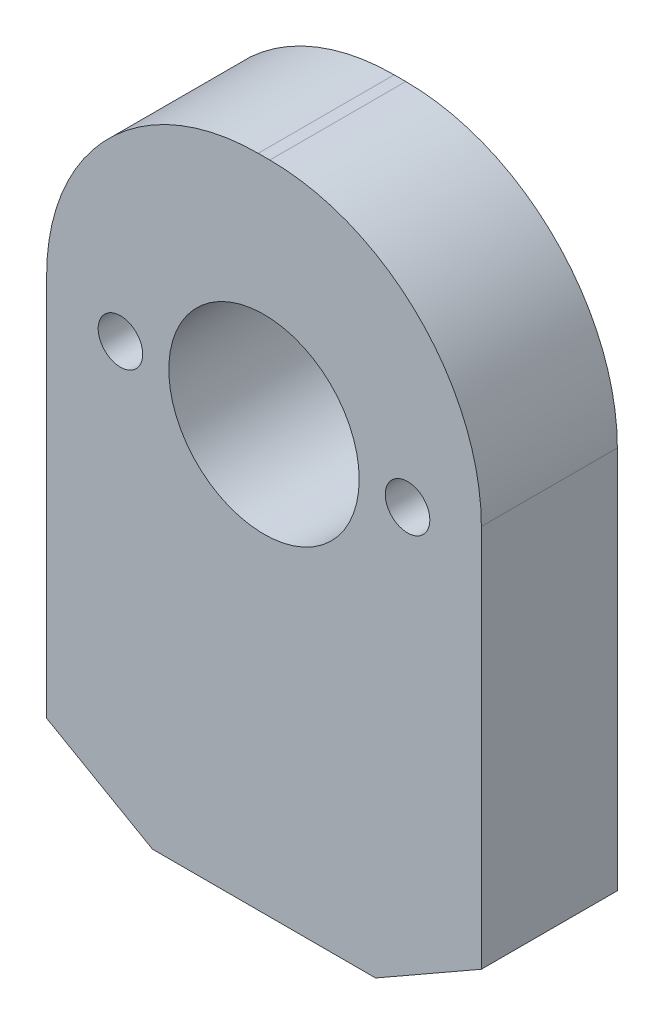
ISO-10303-21;
HEADER;
FILE_DESCRIPTION(('STEP AP214'),'2;1');
FILE_NAME('part.step','',(''),(''),'','','');
FILE_SCHEMA(('AUTOMOTIVE_DESIGN { 1 0 10303 214 1 1 1 1 }'));
ENDSEC;
DATA;
#1=APPLICATION_CONTEXT('core data for automotive mechanical design processes');
#2=APPLICATION_PROTOCOL_DEFINITION('international standard','automotive_design',2000,#1);
#3=PRODUCT_CONTEXT('',#1,'mechanical');
#4=PRODUCT('Part','Part','',(#3));
#5=PRODUCT_RELATED_PRODUCT_CATEGORY('part','',(#4));
#6=PRODUCT_DEFINITION_FORMATION('','',#4);
#7=PRODUCT_DEFINITION_CONTEXT('part definition',#1,'design');
#8=PRODUCT_DEFINITION('design','',#6,#7);
#9=PRODUCT_DEFINITION_SHAPE('','',#8);
#10=(LENGTH_UNIT() NAMED_UNIT(*) SI_UNIT(.MILLI.,.METRE.));
#11=(NAMED_UNIT(*) PLANE_ANGLE_UNIT() SI_UNIT($,.RADIAN.));
#12=(NAMED_UNIT(*) SI_UNIT($,.STERADIAN.) SOLID_ANGLE_UNIT());
#13=UNCERTAINTY_MEASURE_WITH_UNIT(LENGTH_MEASURE(1.E-05),#10,'distance_accuracy_value','');
#14=(GEOMETRIC_REPRESENTATION_CONTEXT(3) GLOBAL_UNCERTAINTY_ASSIGNED_CONTEXT((#13)) GLOBAL_UNIT_ASSIGNED_CONTEXT((#10,
#11,#12)) REPRESENTATION_CONTEXT('',''));
#15=CARTESIAN_POINT('',(0.,0.,0.));
#16=DIRECTION('',(0.,0.,1.));
#17=DIRECTION('',(1.,0.,0.));
#18=AXIS2_PLACEMENT_3D('',#15,#16,#17);
#19=CARTESIAN_POINT('',(14.77,29.38,9.));
#20=DIRECTION('',(0.,0.,-1.));
#21=DIRECTION('',(-1.,0.,0.));
#22=AXIS2_PLACEMENT_3D('',#19,#20,#21);
#23=PLANE('',#22);
#24=CARTESIAN_POINT('',(4.885,28.04,9.));
#25=DIRECTION('',(0.,0.,1.));
#26=DIRECTION('',(1.,0.,0.));
#27=AXIS2_PLACEMENT_3D('',#24,#25,#26);
#28=CIRCLE('',#27,1.475);
#29=CARTESIAN_POINT('',(6.36,28.04,9.));
#30=VERTEX_POINT('',#29);
#31=EDGE_CURVE('E195',#30,#30,#28,.T.);
#32=ORIENTED_EDGE('',*,*,#31,.F.);
#33=EDGE_LOOP('',(#32));
#34=FACE_BOUND('',#33,.T.);
#35=CARTESIAN_POINT('',(23.885,28.04,9.));
#36=DIRECTION('',(0.,0.,1.));
#37=DIRECTION('',(1.,0.,0.));
#38=AXIS2_PLACEMENT_3D('',#35,#36,#37);
#39=CIRCLE('',#38,1.475);
#40=CARTESIAN_POINT('',(25.36,28.04,9.));
#41=VERTEX_POINT('',#40);
#42=EDGE_CURVE('E189',#41,#41,#39,.T.);
#43=ORIENTED_EDGE('',*,*,#42,.F.);
#44=EDGE_LOOP('',(#43));
#45=FACE_BOUND('',#44,.T.);
#46=CARTESIAN_POINT('',(14.77,29.38,9.));
#47=DIRECTION('',(0.,0.,1.));
#48=DIRECTION('',(-1.,0.,0.));
#49=AXIS2_PLACEMENT_3D('',#46,#47,#48);
#50=CIRCLE('',#49,14.);
#51=CARTESIAN_POINT('',(28.77,29.3799999999999,9.));
#52=VERTEX_POINT('',#51);
#53=CARTESIAN_POINT('',(14.7699999999999,43.38,9.));
#54=VERTEX_POINT('',#53);
#55=EDGE_CURVE('E149',#52,#54,#50,.T.);
#56=ORIENTED_EDGE('',*,*,#55,.T.);
#57=DIRECTION('',(-1.,0.,0.));
#58=VECTOR('',#57,1.);
#59=CARTESIAN_POINT('',(14.0000000000001,43.38,9.));
#60=LINE('',#59,#58);
#61=CARTESIAN_POINT('',(14.0000000000001,43.38,9.));
#62=VERTEX_POINT('',#61);
#63=EDGE_CURVE('E97',#54,#62,#60,.T.);
#64=ORIENTED_EDGE('',*,*,#63,.T.);
#65=CARTESIAN_POINT('',(14.,29.38,9.));
#66=DIRECTION('',(0.,0.,1.));
#67=DIRECTION('',(-1.,0.,0.));
#68=AXIS2_PLACEMENT_3D('',#65,#66,#67);
#69=CIRCLE('',#68,14.);
#70=CARTESIAN_POINT('',(0.,29.3799999999999,9.));
#71=VERTEX_POINT('',#70);
#72=EDGE_CURVE('E164',#62,#71,#69,.T.);
#73=ORIENTED_EDGE('',*,*,#72,.T.);
#74=DIRECTION('',(0.,-1.,0.));
#75=VECTOR('',#74,1.);
#76=CARTESIAN_POINT('',(0.,4.,9.));
#77=LINE('',#76,#75);
#78=CARTESIAN_POINT('',(0.,4.,9.));
#79=VERTEX_POINT('',#78);
#80=EDGE_CURVE('E177',#71,#79,#77,.T.);
#81=ORIENTED_EDGE('',*,*,#80,.T.);
#82=DIRECTION('',(0.868243142124459,-0.496138938356834,0.));
#83=VECTOR('',#82,1.);
#84=CARTESIAN_POINT('',(0.,4.,9.));
#85=LINE('',#84,#83);
#86=CARTESIAN_POINT('',(7.,0.,9.));
#87=VERTEX_POINT('',#86);
#88=EDGE_CURVE('E116',#79,#87,#85,.T.);
#89=ORIENTED_EDGE('',*,*,#88,.T.);
#90=DIRECTION('',(1.,0.,0.));
#91=VECTOR('',#90,1.);
#92=CARTESIAN_POINT('',(7.,0.,9.));
#93=LINE('',#92,#91);
#94=CARTESIAN_POINT('',(21.77,0.,9.));
#95=VERTEX_POINT('',#94);
#96=EDGE_CURVE('E110',#87,#95,#93,.T.);
#97=ORIENTED_EDGE('',*,*,#96,.T.);
#98=DIRECTION('',(0.868243142124459,0.496138938356834,0.));
#99=VECTOR('',#98,1.);
#100=CARTESIAN_POINT('',(21.77,0.,9.));
#101=LINE('',#100,#99);
#102=CARTESIAN_POINT('',(28.77,4.,9.));
#103=VERTEX_POINT('',#102);
#104=EDGE_CURVE('E114',#95,#103,#101,.T.);
#105=ORIENTED_EDGE('',*,*,#104,.T.);
#106=DIRECTION('',(0.,1.,0.));
#107=VECTOR('',#106,1.);
#108=CARTESIAN_POINT('',(28.77,4.,9.));
#109=LINE('',#108,#107);
#110=EDGE_CURVE('E54',#103,#52,#109,.T.);
#111=ORIENTED_EDGE('',*,*,#110,.T.);
#112=EDGE_LOOP('',(#56,#64,#73,#81,#89,#97,#105,#111));
#113=FACE_BOUND('',#112,.T.);
#114=CARTESIAN_POINT('',(14.385,28.04,9.));
#115=DIRECTION('',(0.,0.,1.));
#116=DIRECTION('',(1.,0.,0.));
#117=AXIS2_PLACEMENT_3D('',#114,#115,#116);
#118=CIRCLE('',#117,6.3);
#119=CARTESIAN_POINT('',(20.685,28.04,9.));
#120=VERTEX_POINT('',#119);
#121=EDGE_CURVE('E138',#120,#120,#118,.T.);
#122=ORIENTED_EDGE('',*,*,#121,.F.);
#123=EDGE_LOOP('',(#122));
#124=FACE_BOUND('',#123,.T.);
#125=ADVANCED_FACE('F37',(#34,#45,#113,#124),#23,.F.);
#126=CARTESIAN_POINT('',(14.77,29.38,0.));
#127=DIRECTION('',(0.,0.,-1.));
#128=DIRECTION('',(-1.,0.,0.));
#129=AXIS2_PLACEMENT_3D('',#126,#127,#128);
#130=PLANE('',#129);
#131=CARTESIAN_POINT('',(14.77,29.38,0.));
#132=DIRECTION('',(0.,0.,1.));
#133=DIRECTION('',(-1.,0.,0.));
#134=AXIS2_PLACEMENT_3D('',#131,#132,#133);
#135=CIRCLE('',#134,14.);
#136=CARTESIAN_POINT('',(28.77,29.3799999999999,0.));
#137=VERTEX_POINT('',#136);
#138=CARTESIAN_POINT('',(14.7699999999999,43.38,0.));
#139=VERTEX_POINT('',#138);
#140=EDGE_CURVE('E134',#137,#139,#135,.T.);
#141=ORIENTED_EDGE('',*,*,#140,.F.);
#142=DIRECTION('',(0.,1.,0.));
#143=VECTOR('',#142,1.);
#144=CARTESIAN_POINT('',(28.77,4.,0.));
#145=LINE('',#144,#143);
#146=CARTESIAN_POINT('',(28.77,4.,0.));
#147=VERTEX_POINT('',#146);
#148=EDGE_CURVE('E89',#147,#137,#145,.T.);
#149=ORIENTED_EDGE('',*,*,#148,.F.);
#150=DIRECTION('',(0.868243142124459,0.496138938356834,0.));
#151=VECTOR('',#150,1.);
#152=CARTESIAN_POINT('',(21.77,0.,0.));
#153=LINE('',#152,#151);
#154=CARTESIAN_POINT('',(21.77,0.,0.));
#155=VERTEX_POINT('',#154);
#156=EDGE_CURVE('E83',#155,#147,#153,.T.);
#157=ORIENTED_EDGE('',*,*,#156,.F.);
#158=DIRECTION('',(1.,0.,0.));
#159=VECTOR('',#158,1.);
#160=CARTESIAN_POINT('',(7.,0.,0.));
#161=LINE('',#160,#159);
#162=CARTESIAN_POINT('',(7.,0.,0.));
#163=VERTEX_POINT('',#162);
#164=EDGE_CURVE('E124',#163,#155,#161,.T.);
#165=ORIENTED_EDGE('',*,*,#164,.F.);
#166=DIRECTION('',(0.868243142124459,-0.496138938356834,0.));
#167=VECTOR('',#166,1.);
#168=CARTESIAN_POINT('',(0.,4.,0.));
#169=LINE('',#168,#167);
#170=CARTESIAN_POINT('',(0.,4.,0.));
#171=VERTEX_POINT('',#170);
#172=EDGE_CURVE('E144',#171,#163,#169,.T.);
#173=ORIENTED_EDGE('',*,*,#172,.F.);
#174=DIRECTION('',(0.,-1.,0.));
#175=VECTOR('',#174,1.);
#176=CARTESIAN_POINT('',(0.,4.,0.));
#177=LINE('',#176,#175);
#178=CARTESIAN_POINT('',(0.,29.3799999999999,0.));
#179=VERTEX_POINT('',#178);
#180=EDGE_CURVE('E142',#179,#171,#177,.T.);
#181=ORIENTED_EDGE('',*,*,#180,.F.);
#182=CARTESIAN_POINT('',(14.,29.38,0.));
#183=DIRECTION('',(0.,0.,1.));
#184=DIRECTION('',(-1.,0.,0.));
#185=AXIS2_PLACEMENT_3D('',#182,#183,#184);
#186=CIRCLE('',#185,14.);
#187=CARTESIAN_POINT('',(14.0000000000001,43.38,0.));
#188=VERTEX_POINT('',#187);
#189=EDGE_CURVE('E140',#188,#179,#186,.T.);
#190=ORIENTED_EDGE('',*,*,#189,.F.);
#191=DIRECTION('',(-1.,0.,0.));
#192=VECTOR('',#191,1.);
#193=CARTESIAN_POINT('',(14.0000000000001,43.38,0.));
#194=LINE('',#193,#192);
#195=EDGE_CURVE('E137',#139,#188,#194,.T.);
#196=ORIENTED_EDGE('',*,*,#195,.F.);
#197=EDGE_LOOP('',(#141,#149,#157,#165,#173,#181,#190,#196));
#198=FACE_BOUND('',#197,.T.);
#199=CARTESIAN_POINT('',(14.385,28.04,0.));
#200=DIRECTION('',(0.,0.,1.));
#201=DIRECTION('',(1.,0.,0.));
#202=AXIS2_PLACEMENT_3D('',#199,#200,#201);
#203=CIRCLE('',#202,6.3);
#204=CARTESIAN_POINT('',(20.685,28.04,0.));
#205=VERTEX_POINT('',#204);
#206=EDGE_CURVE('E183',#205,#205,#203,.T.);
#207=ORIENTED_EDGE('',*,*,#206,.T.);
#208=EDGE_LOOP('',(#207));
#209=FACE_BOUND('',#208,.T.);
#210=ADVANCED_FACE('F168',(#198,#209),#130,.T.);
#211=CARTESIAN_POINT('',(14.77,29.38,9.));
#212=DIRECTION('',(0.,0.,-1.));
#213=DIRECTION('',(-1.,0.,0.));
#214=AXIS2_PLACEMENT_3D('',#211,#212,#213);
#215=CYLINDRICAL_SURFACE('',#214,14.);
#216=ORIENTED_EDGE('',*,*,#140,.T.);
#217=DIRECTION('',(0.,0.,-1.));
#218=VECTOR('',#217,1.);
#219=CARTESIAN_POINT('',(14.7699999999999,43.38,9.));
#220=LINE('',#219,#218);
#221=EDGE_CURVE('E11',#54,#139,#220,.T.);
#222=ORIENTED_EDGE('',*,*,#221,.F.);
#223=ORIENTED_EDGE('',*,*,#55,.F.);
#224=DIRECTION('',(0.,0.,-1.));
#225=VECTOR('',#224,1.);
#226=CARTESIAN_POINT('',(28.77,29.3799999999999,9.));
#227=LINE('',#226,#225);
#228=EDGE_CURVE('E130',#52,#137,#227,.T.);
#229=ORIENTED_EDGE('',*,*,#228,.T.);
#230=EDGE_LOOP('',(#216,#222,#223,#229));
#231=FACE_BOUND('',#230,.T.);
#232=ADVANCED_FACE('F39',(#231),#215,.T.);
#233=CARTESIAN_POINT('',(14.0000000000001,43.38,9.));
#234=DIRECTION('',(0.,-1.,0.));
#235=DIRECTION('',(0.,0.,-1.));
#236=AXIS2_PLACEMENT_3D('',#233,#234,#235);
#237=PLANE('',#236);
#238=ORIENTED_EDGE('',*,*,#195,.T.);
#239=DIRECTION('',(0.,0.,-1.));
#240=VECTOR('',#239,1.);
#241=CARTESIAN_POINT('',(14.0000000000001,43.38,9.));
#242=LINE('',#241,#240);
#243=EDGE_CURVE('E46',#62,#188,#242,.T.);
#244=ORIENTED_EDGE('',*,*,#243,.F.);
#245=ORIENTED_EDGE('',*,*,#63,.F.);
#246=ORIENTED_EDGE('',*,*,#221,.T.);
#247=EDGE_LOOP('',(#238,#244,#245,#246));
#248=FACE_BOUND('',#247,.T.);
#249=ADVANCED_FACE('F244',(#248),#237,.F.);
#250=CARTESIAN_POINT('',(14.,29.38,9.));
#251=DIRECTION('',(0.,0.,-1.));
#252=DIRECTION('',(-1.,0.,0.));
#253=AXIS2_PLACEMENT_3D('',#250,#251,#252);
#254=CYLINDRICAL_SURFACE('',#253,14.);
#255=ORIENTED_EDGE('',*,*,#189,.T.);
#256=DIRECTION('',(0.,0.,-1.));
#257=VECTOR('',#256,1.);
#258=CARTESIAN_POINT('',(0.,29.3799999999999,9.));
#259=LINE('',#258,#257);
#260=EDGE_CURVE('E156',#71,#179,#259,.T.);
#261=ORIENTED_EDGE('',*,*,#260,.F.);
#262=ORIENTED_EDGE('',*,*,#72,.F.);
#263=ORIENTED_EDGE('',*,*,#243,.T.);
#264=EDGE_LOOP('',(#255,#261,#262,#263));
#265=FACE_BOUND('',#264,.T.);
#266=ADVANCED_FACE('F162',(#265),#254,.T.);
#267=CARTESIAN_POINT('',(0.,4.,9.));
#268=DIRECTION('',(1.,0.,0.));
#269=DIRECTION('',(0.,0.,-1.));
#270=AXIS2_PLACEMENT_3D('',#267,#268,#269);
#271=PLANE('',#270);
#272=ORIENTED_EDGE('',*,*,#180,.T.);
#273=DIRECTION('',(0.,0.,-1.));
#274=VECTOR('',#273,1.);
#275=CARTESIAN_POINT('',(0.,4.,9.));
#276=LINE('',#275,#274);
#277=EDGE_CURVE('E153',#79,#171,#276,.T.);
#278=ORIENTED_EDGE('',*,*,#277,.F.);
#279=ORIENTED_EDGE('',*,*,#80,.F.);
#280=ORIENTED_EDGE('',*,*,#260,.T.);
#281=EDGE_LOOP('',(#272,#278,#279,#280));
#282=FACE_BOUND('',#281,.T.);
#283=ADVANCED_FACE('F173',(#282),#271,.F.);
#284=CARTESIAN_POINT('',(0.,4.,9.));
#285=DIRECTION('',(0.496138938356834,0.868243142124459,0.));
#286=DIRECTION('',(-0.868243142124459,0.496138938356834,0.));
#287=AXIS2_PLACEMENT_3D('',#284,#285,#286);
#288=PLANE('',#287);
#289=ORIENTED_EDGE('',*,*,#172,.T.);
#290=DIRECTION('',(0.,0.,-1.));
#291=VECTOR('',#290,1.);
#292=CARTESIAN_POINT('',(7.,0.,9.));
#293=LINE('',#292,#291);
#294=EDGE_CURVE('E125',#87,#163,#293,.T.);
#295=ORIENTED_EDGE('',*,*,#294,.F.);
#296=ORIENTED_EDGE('',*,*,#88,.F.);
#297=ORIENTED_EDGE('',*,*,#277,.T.);
#298=EDGE_LOOP('',(#289,#295,#296,#297));
#299=FACE_BOUND('',#298,.T.);
#300=ADVANCED_FACE('F176',(#299),#288,.F.);
#301=CARTESIAN_POINT('',(7.,0.,9.));
#302=DIRECTION('',(0.,1.,0.));
#303=DIRECTION('',(0.,0.,1.));
#304=AXIS2_PLACEMENT_3D('',#301,#302,#303);
#305=PLANE('',#304);
#306=ORIENTED_EDGE('',*,*,#164,.T.);
#307=DIRECTION('',(0.,0.,-1.));
#308=VECTOR('',#307,1.);
#309=CARTESIAN_POINT('',(21.77,0.,9.));
#310=LINE('',#309,#308);
#311=EDGE_CURVE('E121',#95,#155,#310,.T.);
#312=ORIENTED_EDGE('',*,*,#311,.F.);
#313=ORIENTED_EDGE('',*,*,#96,.F.);
#314=ORIENTED_EDGE('',*,*,#294,.T.);
#315=EDGE_LOOP('',(#306,#312,#313,#314));
#316=FACE_BOUND('',#315,.T.);
#317=ADVANCED_FACE('F122',(#316),#305,.F.);
#318=CARTESIAN_POINT('',(21.77,0.,9.));
#319=DIRECTION('',(-0.496138938356834,0.868243142124459,0.));
#320=DIRECTION('',(-0.868243142124459,-0.496138938356834,0.));
#321=AXIS2_PLACEMENT_3D('',#318,#319,#320);
#322=PLANE('',#321);
#323=ORIENTED_EDGE('',*,*,#156,.T.);
#324=DIRECTION('',(0.,0.,-1.));
#325=VECTOR('',#324,1.);
#326=CARTESIAN_POINT('',(28.77,4.,9.));
#327=LINE('',#326,#325);
#328=EDGE_CURVE('E126',#103,#147,#327,.T.);
#329=ORIENTED_EDGE('',*,*,#328,.F.);
#330=ORIENTED_EDGE('',*,*,#104,.F.);
#331=ORIENTED_EDGE('',*,*,#311,.T.);
#332=EDGE_LOOP('',(#323,#329,#330,#331));
#333=FACE_BOUND('',#332,.T.);
#334=ADVANCED_FACE('F128',(#333),#322,.F.);
#335=CARTESIAN_POINT('',(28.77,4.,9.));
#336=DIRECTION('',(-1.,0.,0.));
#337=DIRECTION('',(0.,0.,1.));
#338=AXIS2_PLACEMENT_3D('',#335,#336,#337);
#339=PLANE('',#338);
#340=ORIENTED_EDGE('',*,*,#148,.T.);
#341=ORIENTED_EDGE('',*,*,#228,.F.);
#342=ORIENTED_EDGE('',*,*,#110,.F.);
#343=ORIENTED_EDGE('',*,*,#328,.T.);
#344=EDGE_LOOP('',(#340,#341,#342,#343));
#345=FACE_BOUND('',#344,.T.);
#346=ADVANCED_FACE('F226',(#345),#339,.F.);
#347=CARTESIAN_POINT('',(14.385,28.04,9.));
#348=DIRECTION('',(0.,0.,-1.));
#349=DIRECTION('',(-1.,0.,0.));
#350=AXIS2_PLACEMENT_3D('',#347,#348,#349);
#351=CYLINDRICAL_SURFACE('',#350,6.3);
#352=ORIENTED_EDGE('',*,*,#121,.T.);
#353=EDGE_LOOP('',(#352));
#354=FACE_BOUND('',#353,.T.);
#355=ORIENTED_EDGE('',*,*,#206,.F.);
#356=EDGE_LOOP('',(#355));
#357=FACE_BOUND('',#356,.T.);
#358=ADVANCED_FACE('F217',(#354,#357),#351,.F.);
#359=CARTESIAN_POINT('',(23.885,28.04,5.));
#360=DIRECTION('',(0.,0.,1.));
#361=DIRECTION('',(1.,0.,0.));
#362=AXIS2_PLACEMENT_3D('',#359,#360,#361);
#363=CYLINDRICAL_SURFACE('',#362,1.475);
#364=CARTESIAN_POINT('',(23.885,28.04,5.));
#365=DIRECTION('',(0.,0.,1.));
#366=DIRECTION('',(1.,0.,0.));
#367=AXIS2_PLACEMENT_3D('',#364,#365,#366);
#368=CIRCLE('',#367,1.475);
#369=CARTESIAN_POINT('',(25.36,28.04,5.));
#370=VERTEX_POINT('',#369);
#371=EDGE_CURVE('E192',#370,#370,#368,.T.);
#372=ORIENTED_EDGE('',*,*,#371,.F.);
#373=EDGE_LOOP('',(#372));
#374=FACE_BOUND('',#373,.T.);
#375=ORIENTED_EDGE('',*,*,#42,.T.);
#376=EDGE_LOOP('',(#375));
#377=FACE_BOUND('',#376,.T.);
#378=ADVANCED_FACE('F215',(#374,#377),#363,.F.);
#379=CARTESIAN_POINT('',(23.885,28.04,5.));
#380=DIRECTION('',(0.,0.,1.));
#381=DIRECTION('',(1.,0.,0.));
#382=AXIS2_PLACEMENT_3D('',#379,#380,#381);
#383=PLANE('',#382);
#384=ORIENTED_EDGE('',*,*,#371,.T.);
#385=EDGE_LOOP('',(#384));
#386=FACE_BOUND('',#385,.T.);
#387=ADVANCED_FACE('F206',(#386),#383,.T.);
#388=CARTESIAN_POINT('',(4.885,28.04,5.));
#389=DIRECTION('',(0.,0.,1.));
#390=DIRECTION('',(1.,0.,0.));
#391=AXIS2_PLACEMENT_3D('',#388,#389,#390);
#392=CYLINDRICAL_SURFACE('',#391,1.475);
#393=CARTESIAN_POINT('',(4.885,28.04,5.));
#394=DIRECTION('',(0.,0.,1.));
#395=DIRECTION('',(1.,0.,0.));
#396=AXIS2_PLACEMENT_3D('',#393,#394,#395);
#397=CIRCLE('',#396,1.475);
#398=CARTESIAN_POINT('',(6.36,28.04,5.));
#399=VERTEX_POINT('',#398);
#400=EDGE_CURVE('E186',#399,#399,#397,.T.);
#401=ORIENTED_EDGE('',*,*,#400,.F.);
#402=EDGE_LOOP('',(#401));
#403=FACE_BOUND('',#402,.T.);
#404=ORIENTED_EDGE('',*,*,#31,.T.);
#405=EDGE_LOOP('',(#404));
#406=FACE_BOUND('',#405,.T.);
#407=ADVANCED_FACE('F203',(#403,#406),#392,.F.);
#408=CARTESIAN_POINT('',(4.885,28.04,5.));
#409=DIRECTION('',(0.,0.,1.));
#410=DIRECTION('',(1.,0.,0.));
#411=AXIS2_PLACEMENT_3D('',#408,#409,#410);
#412=PLANE('',#411);
#413=ORIENTED_EDGE('',*,*,#400,.T.);
#414=EDGE_LOOP('',(#413));
#415=FACE_BOUND('',#414,.T.);
#416=ADVANCED_FACE('F201',(#415),#412,.T.);
#417=CLOSED_SHELL('',(#125,#210,#232,#249,#266,#283,#300,#317,#334,#346,#358,#378,#387,#407,#416));
#418=MANIFOLD_SOLID_BREP('B2',#417);
#419=ADVANCED_BREP_SHAPE_REPRESENTATION('',(#18,#418),#14);
#420=SHAPE_DEFINITION_REPRESENTATION(#9,#419);
ENDSEC;
END-ISO-10303-21;
